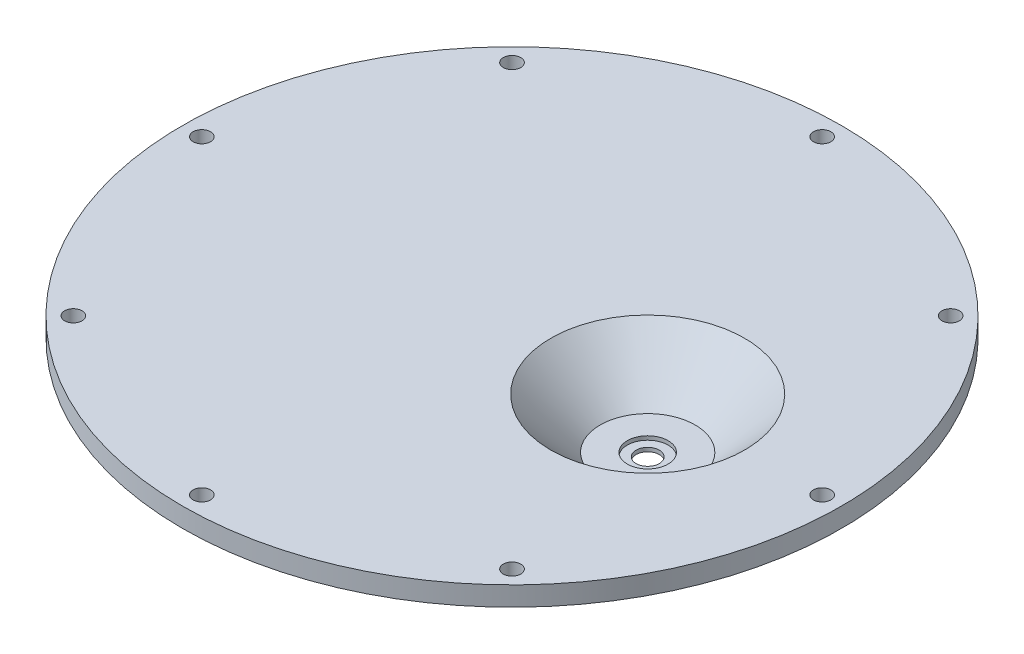
ISO-10303-21;
HEADER;
FILE_DESCRIPTION(('STEP AP214'),'2;1');
FILE_NAME('part.step','',(''),(''),'','','');
FILE_SCHEMA(('AUTOMOTIVE_DESIGN { 1 0 10303 214 1 1 1 1 }'));
ENDSEC;
DATA;
#1=APPLICATION_CONTEXT('core data for automotive mechanical design processes');
#2=APPLICATION_PROTOCOL_DEFINITION('international standard','automotive_design',2000,#1);
#3=PRODUCT_CONTEXT('',#1,'mechanical');
#4=PRODUCT('Part','Part','',(#3));
#5=PRODUCT_RELATED_PRODUCT_CATEGORY('part','',(#4));
#6=PRODUCT_DEFINITION_FORMATION('','',#4);
#7=PRODUCT_DEFINITION_CONTEXT('part definition',#1,'design');
#8=PRODUCT_DEFINITION('design','',#6,#7);
#9=PRODUCT_DEFINITION_SHAPE('','',#8);
#10=(LENGTH_UNIT() NAMED_UNIT(*) SI_UNIT(.MILLI.,.METRE.));
#11=(NAMED_UNIT(*) PLANE_ANGLE_UNIT() SI_UNIT($,.RADIAN.));
#12=(NAMED_UNIT(*) SI_UNIT($,.STERADIAN.) SOLID_ANGLE_UNIT());
#13=UNCERTAINTY_MEASURE_WITH_UNIT(LENGTH_MEASURE(1.E-05),#10,'distance_accuracy_value','');
#14=(GEOMETRIC_REPRESENTATION_CONTEXT(3) GLOBAL_UNCERTAINTY_ASSIGNED_CONTEXT((#13)) GLOBAL_UNIT_ASSIGNED_CONTEXT((#10,
#11,#12)) REPRESENTATION_CONTEXT('',''));
#15=CARTESIAN_POINT('',(0.,0.,0.));
#16=DIRECTION('',(0.,0.,1.));
#17=DIRECTION('',(1.,0.,0.));
#18=AXIS2_PLACEMENT_3D('',#15,#16,#17);
#19=CARTESIAN_POINT('',(35.,-13.,0.));
#20=DIRECTION('',(0.,1.,0.));
#21=DIRECTION('',(0.,0.,1.));
#22=AXIS2_PLACEMENT_3D('',#19,#20,#21);
#23=CONICAL_SURFACE('',#22,12.25,0.77568973056334);
#24=CARTESIAN_POINT('',(35.,0.,0.));
#25=DIRECTION('',(0.,1.,0.));
#26=DIRECTION('',(0.,0.,1.));
#27=AXIS2_PLACEMENT_3D('',#24,#25,#26);
#28=CIRCLE('',#27,25.);
#29=CARTESIAN_POINT('',(35.,0.,25.));
#30=VERTEX_POINT('',#29);
#31=EDGE_CURVE('E67',#30,#30,#28,.T.);
#32=ORIENTED_EDGE('',*,*,#31,.T.);
#33=EDGE_LOOP('',(#32));
#34=FACE_BOUND('',#33,.T.);
#35=CARTESIAN_POINT('',(35.,-13.,0.));
#36=DIRECTION('',(0.,1.,0.));
#37=DIRECTION('',(0.,0.,1.));
#38=AXIS2_PLACEMENT_3D('',#35,#36,#37);
#39=CIRCLE('',#38,12.25);
#40=CARTESIAN_POINT('',(35.,-13.,12.25));
#41=VERTEX_POINT('',#40);
#42=EDGE_CURVE('E10',#41,#41,#39,.T.);
#43=ORIENTED_EDGE('',*,*,#42,.F.);
#44=EDGE_LOOP('',(#43));
#45=FACE_BOUND('',#44,.T.);
#46=ADVANCED_FACE('F35',(#34,#45),#23,.F.);
#47=CARTESIAN_POINT('',(29.75,-13.,0.));
#48=DIRECTION('',(0.,1.,0.));
#49=DIRECTION('',(0.,0.,1.));
#50=AXIS2_PLACEMENT_3D('',#47,#48,#49);
#51=PLANE('',#50);
#52=ORIENTED_EDGE('',*,*,#42,.T.);
#53=EDGE_LOOP('',(#52));
#54=FACE_BOUND('',#53,.T.);
#55=CARTESIAN_POINT('',(35.,-13.,0.));
#56=DIRECTION('',(0.,1.,0.));
#57=DIRECTION('',(0.,0.,1.));
#58=AXIS2_PLACEMENT_3D('',#55,#56,#57);
#59=CIRCLE('',#58,5.25);
#60=CARTESIAN_POINT('',(35.,-13.,5.25));
#61=VERTEX_POINT('',#60);
#62=EDGE_CURVE('E41',#61,#61,#59,.T.);
#63=ORIENTED_EDGE('',*,*,#62,.F.);
#64=EDGE_LOOP('',(#63));
#65=FACE_BOUND('',#64,.T.);
#66=ADVANCED_FACE('F163',(#54,#65),#51,.T.);
#67=CARTESIAN_POINT('',(35.,1.71366666813488,0.));
#68=DIRECTION('',(0.,1.,0.));
#69=DIRECTION('',(0.,0.,1.));
#70=AXIS2_PLACEMENT_3D('',#67,#68,#69);
#71=CYLINDRICAL_SURFACE('',#70,5.25);
#72=ORIENTED_EDGE('',*,*,#62,.T.);
#73=EDGE_LOOP('',(#72));
#74=FACE_BOUND('',#73,.T.);
#75=CARTESIAN_POINT('',(35.,-14.,0.));
#76=DIRECTION('',(0.,1.,0.));
#77=DIRECTION('',(0.,0.,1.));
#78=AXIS2_PLACEMENT_3D('',#75,#76,#77);
#79=CIRCLE('',#78,5.24999999999999);
#80=CARTESIAN_POINT('',(35.,-14.,5.24999999999999));
#81=VERTEX_POINT('',#80);
#82=EDGE_CURVE('E45',#81,#81,#79,.T.);
#83=ORIENTED_EDGE('',*,*,#82,.F.);
#84=EDGE_LOOP('',(#83));
#85=FACE_BOUND('',#84,.T.);
#86=ADVANCED_FACE('F168',(#74,#85),#71,.F.);
#87=CARTESIAN_POINT('',(32.,-14.,0.));
#88=DIRECTION('',(0.,1.,0.));
#89=DIRECTION('',(0.,0.,1.));
#90=AXIS2_PLACEMENT_3D('',#87,#88,#89);
#91=PLANE('',#90);
#92=ORIENTED_EDGE('',*,*,#82,.T.);
#93=EDGE_LOOP('',(#92));
#94=FACE_BOUND('',#93,.T.);
#95=CARTESIAN_POINT('',(35.,-14.,0.));
#96=DIRECTION('',(0.,1.,0.));
#97=DIRECTION('',(0.,0.,1.));
#98=AXIS2_PLACEMENT_3D('',#95,#96,#97);
#99=CIRCLE('',#98,3.);
#100=CARTESIAN_POINT('',(35.,-14.,3.));
#101=VERTEX_POINT('',#100);
#102=EDGE_CURVE('E49',#101,#101,#99,.T.);
#103=ORIENTED_EDGE('',*,*,#102,.F.);
#104=EDGE_LOOP('',(#103));
#105=FACE_BOUND('',#104,.T.);
#106=ADVANCED_FACE('F173',(#94,#105),#91,.T.);
#107=CARTESIAN_POINT('',(35.,1.71366666813488,0.));
#108=DIRECTION('',(0.,1.,0.));
#109=DIRECTION('',(0.,0.,1.));
#110=AXIS2_PLACEMENT_3D('',#107,#108,#109);
#111=CYLINDRICAL_SURFACE('',#110,3.00000000000001);
#112=ORIENTED_EDGE('',*,*,#102,.T.);
#113=EDGE_LOOP('',(#112));
#114=FACE_BOUND('',#113,.T.);
#115=CARTESIAN_POINT('',(35.,-15.,0.));
#116=DIRECTION('',(0.,1.,0.));
#117=DIRECTION('',(0.,0.,1.));
#118=AXIS2_PLACEMENT_3D('',#115,#116,#117);
#119=CIRCLE('',#118,3.00000000000001);
#120=CARTESIAN_POINT('',(35.,-15.,3.00000000000001));
#121=VERTEX_POINT('',#120);
#122=EDGE_CURVE('E54',#121,#121,#119,.T.);
#123=ORIENTED_EDGE('',*,*,#122,.F.);
#124=EDGE_LOOP('',(#123));
#125=FACE_BOUND('',#124,.T.);
#126=ADVANCED_FACE('F179',(#114,#125),#111,.F.);
#127=CARTESIAN_POINT('',(32.,-15.,0.));
#128=DIRECTION('',(0.,-1.,0.));
#129=DIRECTION('',(0.,0.,-1.));
#130=AXIS2_PLACEMENT_3D('',#127,#128,#129);
#131=PLANE('',#130);
#132=ORIENTED_EDGE('',*,*,#122,.T.);
#133=EDGE_LOOP('',(#132));
#134=FACE_BOUND('',#133,.T.);
#135=CARTESIAN_POINT('',(35.,-15.,0.));
#136=DIRECTION('',(0.,1.,0.));
#137=DIRECTION('',(0.,0.,1.));
#138=AXIS2_PLACEMENT_3D('',#135,#136,#137);
#139=CIRCLE('',#138,12.);
#140=CARTESIAN_POINT('',(35.,-15.,12.));
#141=VERTEX_POINT('',#140);
#142=EDGE_CURVE('E57',#141,#141,#139,.T.);
#143=ORIENTED_EDGE('',*,*,#142,.F.);
#144=EDGE_LOOP('',(#143));
#145=FACE_BOUND('',#144,.T.);
#146=ADVANCED_FACE('F159',(#134,#145),#131,.T.);
#147=CARTESIAN_POINT('',(35.,-5.,0.));
#148=DIRECTION('',(0.,1.,0.));
#149=DIRECTION('',(0.,0.,1.));
#150=AXIS2_PLACEMENT_3D('',#147,#148,#149);
#151=CONICAL_SURFACE('',#150,25.,0.91510070055336);
#152=ORIENTED_EDGE('',*,*,#142,.T.);
#153=EDGE_LOOP('',(#152));
#154=FACE_BOUND('',#153,.T.);
#155=CARTESIAN_POINT('',(35.,-5.,0.));
#156=DIRECTION('',(0.,1.,0.));
#157=DIRECTION('',(0.,0.,1.));
#158=AXIS2_PLACEMENT_3D('',#155,#156,#157);
#159=CIRCLE('',#158,25.);
#160=CARTESIAN_POINT('',(35.,-5.,25.));
#161=VERTEX_POINT('',#160);
#162=EDGE_CURVE('E60',#161,#161,#159,.T.);
#163=ORIENTED_EDGE('',*,*,#162,.F.);
#164=EDGE_LOOP('',(#163));
#165=FACE_BOUND('',#164,.T.);
#166=ADVANCED_FACE('F150',(#154,#165),#151,.T.);
#167=CARTESIAN_POINT('',(0.,-5.,0.));
#168=DIRECTION('',(0.,1.,0.));
#169=DIRECTION('',(0.,0.,1.));
#170=AXIS2_PLACEMENT_3D('',#167,#168,#169);
#171=CYLINDRICAL_SURFACE('',#170,85.);
#172=CARTESIAN_POINT('',(0.,-5.,0.));
#173=DIRECTION('',(0.,1.,0.));
#174=DIRECTION('',(0.,0.,1.));
#175=AXIS2_PLACEMENT_3D('',#172,#173,#174);
#176=CIRCLE('',#175,85.);
#177=CARTESIAN_POINT('',(0.,-5.,85.));
#178=VERTEX_POINT('',#177);
#179=EDGE_CURVE('E63',#178,#178,#176,.T.);
#180=ORIENTED_EDGE('',*,*,#179,.T.);
#181=EDGE_LOOP('',(#180));
#182=FACE_BOUND('',#181,.T.);
#183=CARTESIAN_POINT('',(0.,0.,0.));
#184=DIRECTION('',(0.,1.,0.));
#185=DIRECTION('',(0.,0.,1.));
#186=AXIS2_PLACEMENT_3D('',#183,#184,#185);
#187=CIRCLE('',#186,85.);
#188=CARTESIAN_POINT('',(0.,0.,85.));
#189=VERTEX_POINT('',#188);
#190=EDGE_CURVE('E64',#189,#189,#187,.T.);
#191=ORIENTED_EDGE('',*,*,#190,.F.);
#192=EDGE_LOOP('',(#191));
#193=FACE_BOUND('',#192,.T.);
#194=ADVANCED_FACE('F148',(#182,#193),#171,.T.);
#195=CARTESIAN_POINT('',(0.,-5.,0.));
#196=DIRECTION('',(0.,1.,0.));
#197=DIRECTION('',(0.,0.,1.));
#198=AXIS2_PLACEMENT_3D('',#195,#196,#197);
#199=PLANE('',#198);
#200=CARTESIAN_POINT('',(80.,-5.,0.));
#201=DIRECTION('',(0.,1.,0.));
#202=DIRECTION('',(0.,0.,1.));
#203=AXIS2_PLACEMENT_3D('',#200,#201,#202);
#204=CIRCLE('',#203,2.25);
#205=CARTESIAN_POINT('',(80.,-5.,2.25));
#206=VERTEX_POINT('',#205);
#207=EDGE_CURVE('E114',#206,#206,#204,.T.);
#208=ORIENTED_EDGE('',*,*,#207,.T.);
#209=EDGE_LOOP('',(#208));
#210=FACE_BOUND('',#209,.T.);
#211=CARTESIAN_POINT('',(56.5685424949238,-5.,56.5685424949238));
#212=DIRECTION('',(0.,1.,0.));
#213=DIRECTION('',(0.,0.,1.));
#214=AXIS2_PLACEMENT_3D('',#211,#212,#213);
#215=CIRCLE('',#214,2.25);
#216=CARTESIAN_POINT('',(56.5685424949238,-5.,58.8185424949238));
#217=VERTEX_POINT('',#216);
#218=EDGE_CURVE('E108',#217,#217,#215,.T.);
#219=ORIENTED_EDGE('',*,*,#218,.T.);
#220=EDGE_LOOP('',(#219));
#221=FACE_BOUND('',#220,.T.);
#222=CARTESIAN_POINT('',(0.,-5.,80.));
#223=DIRECTION('',(0.,1.,0.));
#224=DIRECTION('',(0.,0.,1.));
#225=AXIS2_PLACEMENT_3D('',#222,#223,#224);
#226=CIRCLE('',#225,2.25);
#227=CARTESIAN_POINT('',(0.,-5.,82.25));
#228=VERTEX_POINT('',#227);
#229=EDGE_CURVE('E102',#228,#228,#226,.T.);
#230=ORIENTED_EDGE('',*,*,#229,.T.);
#231=EDGE_LOOP('',(#230));
#232=FACE_BOUND('',#231,.T.);
#233=CARTESIAN_POINT('',(-56.5685424949238,-5.,56.5685424949238));
#234=DIRECTION('',(0.,1.,0.));
#235=DIRECTION('',(0.,0.,1.));
#236=AXIS2_PLACEMENT_3D('',#233,#234,#235);
#237=CIRCLE('',#236,2.25);
#238=CARTESIAN_POINT('',(-56.5685424949238,-5.,58.8185424949238));
#239=VERTEX_POINT('',#238);
#240=EDGE_CURVE('E96',#239,#239,#237,.T.);
#241=ORIENTED_EDGE('',*,*,#240,.T.);
#242=EDGE_LOOP('',(#241));
#243=FACE_BOUND('',#242,.T.);
#244=CARTESIAN_POINT('',(-80.,-5.,0.));
#245=DIRECTION('',(0.,1.,0.));
#246=DIRECTION('',(0.,0.,1.));
#247=AXIS2_PLACEMENT_3D('',#244,#245,#246);
#248=CIRCLE('',#247,2.25);
#249=CARTESIAN_POINT('',(-80.,-5.,2.24999999999999));
#250=VERTEX_POINT('',#249);
#251=EDGE_CURVE('E90',#250,#250,#248,.T.);
#252=ORIENTED_EDGE('',*,*,#251,.T.);
#253=EDGE_LOOP('',(#252));
#254=FACE_BOUND('',#253,.T.);
#255=CARTESIAN_POINT('',(-56.5685424949238,-5.,-56.5685424949238));
#256=DIRECTION('',(0.,1.,0.));
#257=DIRECTION('',(0.,0.,1.));
#258=AXIS2_PLACEMENT_3D('',#255,#256,#257);
#259=CIRCLE('',#258,2.25);
#260=CARTESIAN_POINT('',(-56.5685424949238,-5.,-54.3185424949238));
#261=VERTEX_POINT('',#260);
#262=EDGE_CURVE('E84',#261,#261,#259,.T.);
#263=ORIENTED_EDGE('',*,*,#262,.T.);
#264=EDGE_LOOP('',(#263));
#265=FACE_BOUND('',#264,.T.);
#266=CARTESIAN_POINT('',(0.,-5.,-80.));
#267=DIRECTION('',(0.,1.,0.));
#268=DIRECTION('',(0.,0.,1.));
#269=AXIS2_PLACEMENT_3D('',#266,#267,#268);
#270=CIRCLE('',#269,2.25);
#271=CARTESIAN_POINT('',(0.,-5.,-77.75));
#272=VERTEX_POINT('',#271);
#273=EDGE_CURVE('E78',#272,#272,#270,.T.);
#274=ORIENTED_EDGE('',*,*,#273,.T.);
#275=EDGE_LOOP('',(#274));
#276=FACE_BOUND('',#275,.T.);
#277=CARTESIAN_POINT('',(56.5685424949238,-5.,-56.5685424949238));
#278=DIRECTION('',(0.,1.,0.));
#279=DIRECTION('',(0.,0.,1.));
#280=AXIS2_PLACEMENT_3D('',#277,#278,#279);
#281=CIRCLE('',#280,2.25);
#282=CARTESIAN_POINT('',(56.5685424949238,-5.,-54.3185424949238));
#283=VERTEX_POINT('',#282);
#284=EDGE_CURVE('E72',#283,#283,#281,.T.);
#285=ORIENTED_EDGE('',*,*,#284,.T.);
#286=EDGE_LOOP('',(#285));
#287=FACE_BOUND('',#286,.T.);
#288=ORIENTED_EDGE('',*,*,#162,.T.);
#289=EDGE_LOOP('',(#288));
#290=FACE_BOUND('',#289,.T.);
#291=ORIENTED_EDGE('',*,*,#179,.F.);
#292=EDGE_LOOP('',(#291));
#293=FACE_BOUND('',#292,.T.);
#294=ADVANCED_FACE('F128',(#210,#221,#232,#243,#254,#265,#276,#287,#290,#293),#199,.F.);
#295=CARTESIAN_POINT('',(0.,0.,0.));
#296=DIRECTION('',(0.,1.,0.));
#297=DIRECTION('',(0.,0.,1.));
#298=AXIS2_PLACEMENT_3D('',#295,#296,#297);
#299=PLANE('',#298);
#300=CARTESIAN_POINT('',(80.,0.,0.));
#301=DIRECTION('',(0.,1.,0.));
#302=DIRECTION('',(0.,0.,1.));
#303=AXIS2_PLACEMENT_3D('',#300,#301,#302);
#304=CIRCLE('',#303,2.25);
#305=CARTESIAN_POINT('',(80.,0.,2.25));
#306=VERTEX_POINT('',#305);
#307=EDGE_CURVE('E117',#306,#306,#304,.T.);
#308=ORIENTED_EDGE('',*,*,#307,.F.);
#309=EDGE_LOOP('',(#308));
#310=FACE_BOUND('',#309,.T.);
#311=CARTESIAN_POINT('',(56.5685424949238,0.,56.5685424949238));
#312=DIRECTION('',(0.,1.,0.));
#313=DIRECTION('',(0.,0.,1.));
#314=AXIS2_PLACEMENT_3D('',#311,#312,#313);
#315=CIRCLE('',#314,2.25);
#316=CARTESIAN_POINT('',(56.5685424949238,0.,58.8185424949238));
#317=VERTEX_POINT('',#316);
#318=EDGE_CURVE('E111',#317,#317,#315,.T.);
#319=ORIENTED_EDGE('',*,*,#318,.F.);
#320=EDGE_LOOP('',(#319));
#321=FACE_BOUND('',#320,.T.);
#322=CARTESIAN_POINT('',(0.,0.,80.));
#323=DIRECTION('',(0.,1.,0.));
#324=DIRECTION('',(0.,0.,1.));
#325=AXIS2_PLACEMENT_3D('',#322,#323,#324);
#326=CIRCLE('',#325,2.25);
#327=CARTESIAN_POINT('',(0.,0.,82.25));
#328=VERTEX_POINT('',#327);
#329=EDGE_CURVE('E105',#328,#328,#326,.T.);
#330=ORIENTED_EDGE('',*,*,#329,.F.);
#331=EDGE_LOOP('',(#330));
#332=FACE_BOUND('',#331,.T.);
#333=CARTESIAN_POINT('',(-56.5685424949238,0.,56.5685424949238));
#334=DIRECTION('',(0.,1.,0.));
#335=DIRECTION('',(0.,0.,1.));
#336=AXIS2_PLACEMENT_3D('',#333,#334,#335);
#337=CIRCLE('',#336,2.25);
#338=CARTESIAN_POINT('',(-56.5685424949238,0.,58.8185424949238));
#339=VERTEX_POINT('',#338);
#340=EDGE_CURVE('E99',#339,#339,#337,.T.);
#341=ORIENTED_EDGE('',*,*,#340,.F.);
#342=EDGE_LOOP('',(#341));
#343=FACE_BOUND('',#342,.T.);
#344=CARTESIAN_POINT('',(-80.,0.,0.));
#345=DIRECTION('',(0.,1.,0.));
#346=DIRECTION('',(0.,0.,1.));
#347=AXIS2_PLACEMENT_3D('',#344,#345,#346);
#348=CIRCLE('',#347,2.25);
#349=CARTESIAN_POINT('',(-80.,0.,2.24999999999999));
#350=VERTEX_POINT('',#349);
#351=EDGE_CURVE('E93',#350,#350,#348,.T.);
#352=ORIENTED_EDGE('',*,*,#351,.F.);
#353=EDGE_LOOP('',(#352));
#354=FACE_BOUND('',#353,.T.);
#355=CARTESIAN_POINT('',(-56.5685424949238,0.,-56.5685424949238));
#356=DIRECTION('',(0.,1.,0.));
#357=DIRECTION('',(0.,0.,1.));
#358=AXIS2_PLACEMENT_3D('',#355,#356,#357);
#359=CIRCLE('',#358,2.25);
#360=CARTESIAN_POINT('',(-56.5685424949238,0.,-54.3185424949238));
#361=VERTEX_POINT('',#360);
#362=EDGE_CURVE('E87',#361,#361,#359,.T.);
#363=ORIENTED_EDGE('',*,*,#362,.F.);
#364=EDGE_LOOP('',(#363));
#365=FACE_BOUND('',#364,.T.);
#366=CARTESIAN_POINT('',(0.,0.,-80.));
#367=DIRECTION('',(0.,1.,0.));
#368=DIRECTION('',(0.,0.,1.));
#369=AXIS2_PLACEMENT_3D('',#366,#367,#368);
#370=CIRCLE('',#369,2.25);
#371=CARTESIAN_POINT('',(0.,0.,-77.75));
#372=VERTEX_POINT('',#371);
#373=EDGE_CURVE('E81',#372,#372,#370,.T.);
#374=ORIENTED_EDGE('',*,*,#373,.F.);
#375=EDGE_LOOP('',(#374));
#376=FACE_BOUND('',#375,.T.);
#377=CARTESIAN_POINT('',(56.5685424949238,0.,-56.5685424949238));
#378=DIRECTION('',(0.,1.,0.));
#379=DIRECTION('',(0.,0.,1.));
#380=AXIS2_PLACEMENT_3D('',#377,#378,#379);
#381=CIRCLE('',#380,2.25);
#382=CARTESIAN_POINT('',(56.5685424949238,0.,-54.3185424949238));
#383=VERTEX_POINT('',#382);
#384=EDGE_CURVE('E75',#383,#383,#381,.T.);
#385=ORIENTED_EDGE('',*,*,#384,.F.);
#386=EDGE_LOOP('',(#385));
#387=FACE_BOUND('',#386,.T.);
#388=ORIENTED_EDGE('',*,*,#31,.F.);
#389=EDGE_LOOP('',(#388));
#390=FACE_BOUND('',#389,.T.);
#391=ORIENTED_EDGE('',*,*,#190,.T.);
#392=EDGE_LOOP('',(#391));
#393=FACE_BOUND('',#392,.T.);
#394=ADVANCED_FACE('F124',(#310,#321,#332,#343,#354,#365,#376,#387,#390,#393),#299,.T.);
#395=CARTESIAN_POINT('',(56.5685424949238,0.,-56.5685424949238));
#396=DIRECTION('',(0.,1.,0.));
#397=DIRECTION('',(0.,0.,1.));
#398=AXIS2_PLACEMENT_3D('',#395,#396,#397);
#399=CYLINDRICAL_SURFACE('',#398,2.25);
#400=ORIENTED_EDGE('',*,*,#384,.T.);
#401=EDGE_LOOP('',(#400));
#402=FACE_BOUND('',#401,.T.);
#403=ORIENTED_EDGE('',*,*,#284,.F.);
#404=EDGE_LOOP('',(#403));
#405=FACE_BOUND('',#404,.T.);
#406=ADVANCED_FACE('F127',(#402,#405),#399,.F.);
#407=CARTESIAN_POINT('',(0.,0.,-80.));
#408=DIRECTION('',(0.,1.,0.));
#409=DIRECTION('',(0.,0.,1.));
#410=AXIS2_PLACEMENT_3D('',#407,#408,#409);
#411=CYLINDRICAL_SURFACE('',#410,2.25);
#412=ORIENTED_EDGE('',*,*,#373,.T.);
#413=EDGE_LOOP('',(#412));
#414=FACE_BOUND('',#413,.T.);
#415=ORIENTED_EDGE('',*,*,#273,.F.);
#416=EDGE_LOOP('',(#415));
#417=FACE_BOUND('',#416,.T.);
#418=ADVANCED_FACE('F228',(#414,#417),#411,.F.);
#419=CARTESIAN_POINT('',(-56.5685424949238,0.,-56.5685424949238));
#420=DIRECTION('',(0.,1.,0.));
#421=DIRECTION('',(0.,0.,1.));
#422=AXIS2_PLACEMENT_3D('',#419,#420,#421);
#423=CYLINDRICAL_SURFACE('',#422,2.25);
#424=ORIENTED_EDGE('',*,*,#362,.T.);
#425=EDGE_LOOP('',(#424));
#426=FACE_BOUND('',#425,.T.);
#427=ORIENTED_EDGE('',*,*,#262,.F.);
#428=EDGE_LOOP('',(#427));
#429=FACE_BOUND('',#428,.T.);
#430=ADVANCED_FACE('F238',(#426,#429),#423,.F.);
#431=CARTESIAN_POINT('',(-80.,0.,0.));
#432=DIRECTION('',(0.,1.,0.));
#433=DIRECTION('',(0.,0.,1.));
#434=AXIS2_PLACEMENT_3D('',#431,#432,#433);
#435=CYLINDRICAL_SURFACE('',#434,2.25);
#436=ORIENTED_EDGE('',*,*,#351,.T.);
#437=EDGE_LOOP('',(#436));
#438=FACE_BOUND('',#437,.T.);
#439=ORIENTED_EDGE('',*,*,#251,.F.);
#440=EDGE_LOOP('',(#439));
#441=FACE_BOUND('',#440,.T.);
#442=ADVANCED_FACE('F248',(#438,#441),#435,.F.);
#443=CARTESIAN_POINT('',(-56.5685424949238,0.,56.5685424949238));
#444=DIRECTION('',(0.,1.,0.));
#445=DIRECTION('',(0.,0.,1.));
#446=AXIS2_PLACEMENT_3D('',#443,#444,#445);
#447=CYLINDRICAL_SURFACE('',#446,2.25);
#448=ORIENTED_EDGE('',*,*,#340,.T.);
#449=EDGE_LOOP('',(#448));
#450=FACE_BOUND('',#449,.T.);
#451=ORIENTED_EDGE('',*,*,#240,.F.);
#452=EDGE_LOOP('',(#451));
#453=FACE_BOUND('',#452,.T.);
#454=ADVANCED_FACE('F258',(#450,#453),#447,.F.);
#455=CARTESIAN_POINT('',(0.,0.,80.));
#456=DIRECTION('',(0.,1.,0.));
#457=DIRECTION('',(0.,0.,1.));
#458=AXIS2_PLACEMENT_3D('',#455,#456,#457);
#459=CYLINDRICAL_SURFACE('',#458,2.25);
#460=ORIENTED_EDGE('',*,*,#329,.T.);
#461=EDGE_LOOP('',(#460));
#462=FACE_BOUND('',#461,.T.);
#463=ORIENTED_EDGE('',*,*,#229,.F.);
#464=EDGE_LOOP('',(#463));
#465=FACE_BOUND('',#464,.T.);
#466=ADVANCED_FACE('F268',(#462,#465),#459,.F.);
#467=CARTESIAN_POINT('',(56.5685424949238,0.,56.5685424949238));
#468=DIRECTION('',(0.,1.,0.));
#469=DIRECTION('',(0.,0.,1.));
#470=AXIS2_PLACEMENT_3D('',#467,#468,#469);
#471=CYLINDRICAL_SURFACE('',#470,2.25);
#472=ORIENTED_EDGE('',*,*,#318,.T.);
#473=EDGE_LOOP('',(#472));
#474=FACE_BOUND('',#473,.T.);
#475=ORIENTED_EDGE('',*,*,#218,.F.);
#476=EDGE_LOOP('',(#475));
#477=FACE_BOUND('',#476,.T.);
#478=ADVANCED_FACE('F278',(#474,#477),#471,.F.);
#479=CARTESIAN_POINT('',(80.,0.,0.));
#480=DIRECTION('',(0.,1.,0.));
#481=DIRECTION('',(0.,0.,1.));
#482=AXIS2_PLACEMENT_3D('',#479,#480,#481);
#483=CYLINDRICAL_SURFACE('',#482,2.25);
#484=ORIENTED_EDGE('',*,*,#307,.T.);
#485=EDGE_LOOP('',(#484));
#486=FACE_BOUND('',#485,.T.);
#487=ORIENTED_EDGE('',*,*,#207,.F.);
#488=EDGE_LOOP('',(#487));
#489=FACE_BOUND('',#488,.T.);
#490=ADVANCED_FACE('F121',(#486,#489),#483,.F.);
#491=CLOSED_SHELL('',(#46,#66,#86,#106,#126,#146,#166,#194,#294,#394,#406,#418,#430,#442,#454,
#466,#478,#490));
#492=MANIFOLD_SOLID_BREP('B2',#491);
#493=ADVANCED_BREP_SHAPE_REPRESENTATION('',(#18,#492),#14);
#494=SHAPE_DEFINITION_REPRESENTATION(#9,#493);
ENDSEC;
END-ISO-10303-21;
